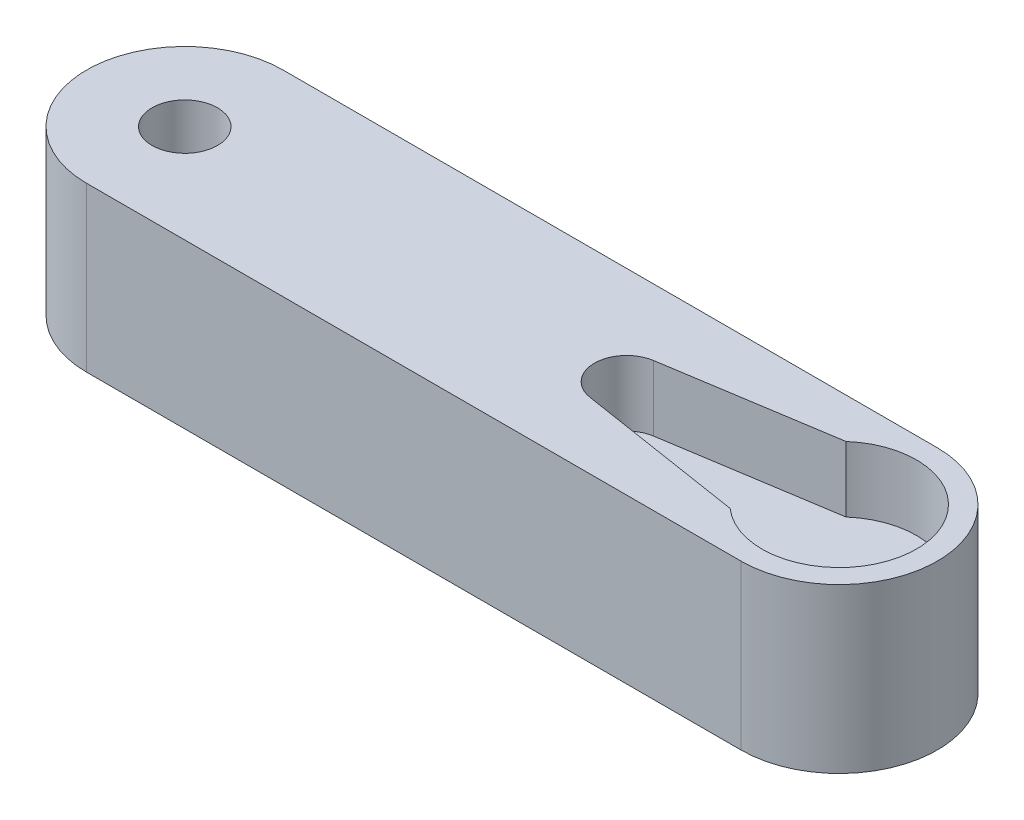
ISO-10303-21;
HEADER;
FILE_DESCRIPTION(('STEP AP214'),'2;1');
FILE_NAME('part.step','',(''),(''),'','','');
FILE_SCHEMA(('AUTOMOTIVE_DESIGN { 1 0 10303 214 1 1 1 1 }'));
ENDSEC;
DATA;
#1=APPLICATION_CONTEXT('core data for automotive mechanical design processes');
#2=APPLICATION_PROTOCOL_DEFINITION('international standard','automotive_design',2000,#1);
#3=PRODUCT_CONTEXT('',#1,'mechanical');
#4=PRODUCT('Part','Part','',(#3));
#5=PRODUCT_RELATED_PRODUCT_CATEGORY('part','',(#4));
#6=PRODUCT_DEFINITION_FORMATION('','',#4);
#7=PRODUCT_DEFINITION_CONTEXT('part definition',#1,'design');
#8=PRODUCT_DEFINITION('design','',#6,#7);
#9=PRODUCT_DEFINITION_SHAPE('','',#8);
#10=(LENGTH_UNIT() NAMED_UNIT(*) SI_UNIT(.MILLI.,.METRE.));
#11=(NAMED_UNIT(*) PLANE_ANGLE_UNIT() SI_UNIT($,.RADIAN.));
#12=(NAMED_UNIT(*) SI_UNIT($,.STERADIAN.) SOLID_ANGLE_UNIT());
#13=UNCERTAINTY_MEASURE_WITH_UNIT(LENGTH_MEASURE(1.E-05),#10,'distance_accuracy_value','');
#14=(GEOMETRIC_REPRESENTATION_CONTEXT(3) GLOBAL_UNCERTAINTY_ASSIGNED_CONTEXT((#13)) GLOBAL_UNIT_ASSIGNED_CONTEXT((#10,
#11,#12)) REPRESENTATION_CONTEXT('',''));
#15=CARTESIAN_POINT('',(0.,0.,0.));
#16=DIRECTION('',(0.,0.,1.));
#17=DIRECTION('',(1.,0.,0.));
#18=AXIS2_PLACEMENT_3D('',#15,#16,#17);
#19=CARTESIAN_POINT('',(-25.4,12.7,0.));
#20=DIRECTION('',(0.,-1.,0.));
#21=DIRECTION('',(0.,0.,-1.));
#22=AXIS2_PLACEMENT_3D('',#19,#20,#21);
#23=CYLINDRICAL_SURFACE('',#22,7.62);
#24=CARTESIAN_POINT('',(-25.4,0.,0.));
#25=DIRECTION('',(0.,1.,0.));
#26=DIRECTION('',(0.,0.,1.));
#27=AXIS2_PLACEMENT_3D('',#24,#25,#26);
#28=CIRCLE('',#27,7.62);
#29=CARTESIAN_POINT('',(-25.4,0.,-7.62));
#30=VERTEX_POINT('',#29);
#31=CARTESIAN_POINT('',(-25.4,0.,7.62));
#32=VERTEX_POINT('',#31);
#33=EDGE_CURVE('E154',#30,#32,#28,.T.);
#34=ORIENTED_EDGE('',*,*,#33,.T.);
#35=DIRECTION('',(0.,-1.,0.));
#36=VECTOR('',#35,1.);
#37=CARTESIAN_POINT('',(-25.4,12.7,7.62));
#38=LINE('',#37,#36);
#39=CARTESIAN_POINT('',(-25.4,12.7,7.62));
#40=VERTEX_POINT('',#39);
#41=EDGE_CURVE('E11',#40,#32,#38,.T.);
#42=ORIENTED_EDGE('',*,*,#41,.F.);
#43=CARTESIAN_POINT('',(-25.4,12.7,0.));
#44=DIRECTION('',(0.,1.,0.));
#45=DIRECTION('',(0.,0.,1.));
#46=AXIS2_PLACEMENT_3D('',#43,#44,#45);
#47=CIRCLE('',#46,7.62);
#48=CARTESIAN_POINT('',(-25.4,12.7,-7.62));
#49=VERTEX_POINT('',#48);
#50=EDGE_CURVE('E157',#49,#40,#47,.T.);
#51=ORIENTED_EDGE('',*,*,#50,.F.);
#52=DIRECTION('',(0.,-1.,0.));
#53=VECTOR('',#52,1.);
#54=CARTESIAN_POINT('',(-25.4,12.7,-7.62));
#55=LINE('',#54,#53);
#56=EDGE_CURVE('E163',#49,#30,#55,.T.);
#57=ORIENTED_EDGE('',*,*,#56,.T.);
#58=EDGE_LOOP('',(#34,#42,#51,#57));
#59=FACE_BOUND('',#58,.T.);
#60=ADVANCED_FACE('F39',(#59),#23,.T.);
#61=CARTESIAN_POINT('',(-25.4,12.7,7.62));
#62=DIRECTION('',(0.,0.,-1.));
#63=DIRECTION('',(-1.,0.,0.));
#64=AXIS2_PLACEMENT_3D('',#61,#62,#63);
#65=PLANE('',#64);
#66=DIRECTION('',(1.,0.,0.));
#67=VECTOR('',#66,1.);
#68=CARTESIAN_POINT('',(-25.4,0.,7.62));
#69=LINE('',#68,#67);
#70=CARTESIAN_POINT('',(25.4,0.,7.62));
#71=VERTEX_POINT('',#70);
#72=EDGE_CURVE('E166',#32,#71,#69,.T.);
#73=ORIENTED_EDGE('',*,*,#72,.T.);
#74=DIRECTION('',(0.,-1.,0.));
#75=VECTOR('',#74,1.);
#76=CARTESIAN_POINT('',(25.4,12.7,7.62));
#77=LINE('',#76,#75);
#78=CARTESIAN_POINT('',(25.4,12.7,7.62));
#79=VERTEX_POINT('',#78);
#80=EDGE_CURVE('E46',#79,#71,#77,.T.);
#81=ORIENTED_EDGE('',*,*,#80,.F.);
#82=DIRECTION('',(1.,0.,0.));
#83=VECTOR('',#82,1.);
#84=CARTESIAN_POINT('',(-25.4,12.7,7.62));
#85=LINE('',#84,#83);
#86=EDGE_CURVE('E90',#40,#79,#85,.T.);
#87=ORIENTED_EDGE('',*,*,#86,.F.);
#88=ORIENTED_EDGE('',*,*,#41,.T.);
#89=EDGE_LOOP('',(#73,#81,#87,#88));
#90=FACE_BOUND('',#89,.T.);
#91=ADVANCED_FACE('F196',(#90),#65,.F.);
#92=CARTESIAN_POINT('',(25.4,12.7,0.));
#93=DIRECTION('',(0.,-1.,0.));
#94=DIRECTION('',(0.,0.,-1.));
#95=AXIS2_PLACEMENT_3D('',#92,#93,#94);
#96=CYLINDRICAL_SURFACE('',#95,7.62);
#97=CARTESIAN_POINT('',(25.4,0.,0.));
#98=DIRECTION('',(0.,1.,0.));
#99=DIRECTION('',(0.,0.,1.));
#100=AXIS2_PLACEMENT_3D('',#97,#98,#99);
#101=CIRCLE('',#100,7.62);
#102=CARTESIAN_POINT('',(25.4,0.,-7.62));
#103=VERTEX_POINT('',#102);
#104=EDGE_CURVE('E168',#71,#103,#101,.T.);
#105=ORIENTED_EDGE('',*,*,#104,.T.);
#106=DIRECTION('',(0.,-1.,0.));
#107=VECTOR('',#106,1.);
#108=CARTESIAN_POINT('',(25.4,12.7,-7.62));
#109=LINE('',#108,#107);
#110=CARTESIAN_POINT('',(25.4,12.7,-7.62));
#111=VERTEX_POINT('',#110);
#112=EDGE_CURVE('E172',#111,#103,#109,.T.);
#113=ORIENTED_EDGE('',*,*,#112,.F.);
#114=CARTESIAN_POINT('',(25.4,12.7,0.));
#115=DIRECTION('',(0.,1.,0.));
#116=DIRECTION('',(0.,0.,1.));
#117=AXIS2_PLACEMENT_3D('',#114,#115,#116);
#118=CIRCLE('',#117,7.62);
#119=EDGE_CURVE('E160',#79,#111,#118,.T.);
#120=ORIENTED_EDGE('',*,*,#119,.F.);
#121=ORIENTED_EDGE('',*,*,#80,.T.);
#122=EDGE_LOOP('',(#105,#113,#120,#121));
#123=FACE_BOUND('',#122,.T.);
#124=ADVANCED_FACE('F177',(#123),#96,.T.);
#125=CARTESIAN_POINT('',(-25.4,12.7,-7.62));
#126=DIRECTION('',(0.,0.,1.));
#127=DIRECTION('',(1.,0.,0.));
#128=AXIS2_PLACEMENT_3D('',#125,#126,#127);
#129=PLANE('',#128);
#130=DIRECTION('',(-1.,0.,0.));
#131=VECTOR('',#130,1.);
#132=CARTESIAN_POINT('',(-25.4,0.,-7.62));
#133=LINE('',#132,#131);
#134=EDGE_CURVE('E83',#103,#30,#133,.T.);
#135=ORIENTED_EDGE('',*,*,#134,.T.);
#136=ORIENTED_EDGE('',*,*,#56,.F.);
#137=DIRECTION('',(-1.,0.,0.));
#138=VECTOR('',#137,1.);
#139=CARTESIAN_POINT('',(-25.4,12.7,-7.62));
#140=LINE('',#139,#138);
#141=EDGE_CURVE('E62',#111,#49,#140,.T.);
#142=ORIENTED_EDGE('',*,*,#141,.F.);
#143=ORIENTED_EDGE('',*,*,#112,.T.);
#144=EDGE_LOOP('',(#135,#136,#142,#143));
#145=FACE_BOUND('',#144,.T.);
#146=ADVANCED_FACE('F185',(#145),#129,.F.);
#147=CARTESIAN_POINT('',(-25.4,12.7,0.));
#148=DIRECTION('',(0.,1.,0.));
#149=DIRECTION('',(0.,0.,1.));
#150=AXIS2_PLACEMENT_3D('',#147,#148,#149);
#151=PLANE('',#150);
#152=CARTESIAN_POINT('',(8.89999109000001,12.7,1.13785289425066E-13));
#153=DIRECTION('',(0.,1.,0.));
#154=DIRECTION('',(0.,0.,1.));
#155=AXIS2_PLACEMENT_3D('',#152,#153,#154);
#156=CIRCLE('',#155,2.50000135);
#157=CARTESIAN_POINT('',(8.51187668267993,12.7,-2.46969106505892));
#158=VERTEX_POINT('',#157);
#159=CARTESIAN_POINT('',(8.51187668267998,12.7,2.46969106505915));
#160=VERTEX_POINT('',#159);
#161=EDGE_CURVE('E53',#158,#160,#156,.T.);
#162=ORIENTED_EDGE('',*,*,#161,.F.);
#163=DIRECTION('',(-0.987875892570632,0.,0.155245679095352));
#164=VECTOR('',#163,1.);
#165=CARTESIAN_POINT('',(21.4313708903444,12.7,-4.50000242999986));
#166=LINE('',#165,#164);
#167=CARTESIAN_POINT('',(21.4313708903444,12.7,-4.50000242999986));
#168=VERTEX_POINT('',#167);
#169=EDGE_CURVE('E132',#168,#158,#166,.T.);
#170=ORIENTED_EDGE('',*,*,#169,.F.);
#171=CARTESIAN_POINT('',(25.4,12.7,0.));
#172=DIRECTION('',(0.,1.,0.));
#173=DIRECTION('',(0.,0.,1.));
#174=AXIS2_PLACEMENT_3D('',#171,#172,#173);
#175=CIRCLE('',#174,6.00000323999999);
#176=CARTESIAN_POINT('',(21.4313708903446,12.7,4.50000243000003));
#177=VERTEX_POINT('',#176);
#178=EDGE_CURVE('E135',#177,#168,#175,.T.);
#179=ORIENTED_EDGE('',*,*,#178,.F.);
#180=DIRECTION('',(0.987875892570633,0.,0.155245679095345));
#181=VECTOR('',#180,1.);
#182=CARTESIAN_POINT('',(8.51187668267998,12.7,2.46969106505915));
#183=LINE('',#182,#181);
#184=EDGE_CURVE('E141',#160,#177,#183,.T.);
#185=ORIENTED_EDGE('',*,*,#184,.F.);
#186=EDGE_LOOP('',(#162,#170,#179,#185));
#187=FACE_BOUND('',#186,.T.);
#188=CARTESIAN_POINT('',(-25.4,12.7,0.));
#189=DIRECTION('',(0.,1.,0.));
#190=DIRECTION('',(0.,0.,1.));
#191=AXIS2_PLACEMENT_3D('',#188,#189,#190);
#192=CIRCLE('',#191,2.54);
#193=CARTESIAN_POINT('',(-25.4,12.7,2.54));
#194=VERTEX_POINT('',#193);
#195=EDGE_CURVE('E147',#194,#194,#192,.T.);
#196=ORIENTED_EDGE('',*,*,#195,.F.);
#197=EDGE_LOOP('',(#196));
#198=FACE_BOUND('',#197,.T.);
#199=ORIENTED_EDGE('',*,*,#50,.T.);
#200=ORIENTED_EDGE('',*,*,#86,.T.);
#201=ORIENTED_EDGE('',*,*,#119,.T.);
#202=ORIENTED_EDGE('',*,*,#141,.T.);
#203=EDGE_LOOP('',(#199,#200,#201,#202));
#204=FACE_BOUND('',#203,.T.);
#205=ADVANCED_FACE('F187',(#187,#198,#204),#151,.T.);
#206=CARTESIAN_POINT('',(-25.4,0.,0.));
#207=DIRECTION('',(0.,1.,0.));
#208=DIRECTION('',(0.,0.,1.));
#209=AXIS2_PLACEMENT_3D('',#206,#207,#208);
#210=PLANE('',#209);
#211=CARTESIAN_POINT('',(-25.4,0.,0.));
#212=DIRECTION('',(0.,1.,0.));
#213=DIRECTION('',(0.,0.,1.));
#214=AXIS2_PLACEMENT_3D('',#211,#212,#213);
#215=CIRCLE('',#214,2.54);
#216=CARTESIAN_POINT('',(-25.4,0.,2.54));
#217=VERTEX_POINT('',#216);
#218=EDGE_CURVE('E151',#217,#217,#215,.T.);
#219=ORIENTED_EDGE('',*,*,#218,.T.);
#220=EDGE_LOOP('',(#219));
#221=FACE_BOUND('',#220,.T.);
#222=ORIENTED_EDGE('',*,*,#33,.F.);
#223=ORIENTED_EDGE('',*,*,#134,.F.);
#224=ORIENTED_EDGE('',*,*,#104,.F.);
#225=ORIENTED_EDGE('',*,*,#72,.F.);
#226=EDGE_LOOP('',(#222,#223,#224,#225));
#227=FACE_BOUND('',#226,.T.);
#228=ADVANCED_FACE('F181',(#221,#227),#210,.F.);
#229=CARTESIAN_POINT('',(-25.4,0.,0.));
#230=DIRECTION('',(0.,1.,0.));
#231=DIRECTION('',(0.,0.,1.));
#232=AXIS2_PLACEMENT_3D('',#229,#230,#231);
#233=CYLINDRICAL_SURFACE('',#232,2.54);
#234=ORIENTED_EDGE('',*,*,#218,.F.);
#235=EDGE_LOOP('',(#234));
#236=FACE_BOUND('',#235,.T.);
#237=ORIENTED_EDGE('',*,*,#195,.T.);
#238=EDGE_LOOP('',(#237));
#239=FACE_BOUND('',#238,.T.);
#240=ADVANCED_FACE('F231',(#236,#239),#233,.F.);
#241=CARTESIAN_POINT('',(8.89999109000001,7.62,1.13785289425066E-13));
#242=DIRECTION('',(0.,1.,0.));
#243=DIRECTION('',(0.,0.,1.));
#244=AXIS2_PLACEMENT_3D('',#241,#242,#243);
#245=CYLINDRICAL_SURFACE('',#244,2.50000135);
#246=ORIENTED_EDGE('',*,*,#161,.T.);
#247=DIRECTION('',(0.,1.,0.));
#248=VECTOR('',#247,1.);
#249=CARTESIAN_POINT('',(8.51187668267998,7.62,2.46969106505915));
#250=LINE('',#249,#248);
#251=CARTESIAN_POINT('',(8.51187668267998,7.62,2.46969106505915));
#252=VERTEX_POINT('',#251);
#253=EDGE_CURVE('E110',#252,#160,#250,.T.);
#254=ORIENTED_EDGE('',*,*,#253,.F.);
#255=CARTESIAN_POINT('',(8.89999109000001,7.62,1.13785289425066E-13));
#256=DIRECTION('',(0.,1.,0.));
#257=DIRECTION('',(0.,0.,1.));
#258=AXIS2_PLACEMENT_3D('',#255,#256,#257);
#259=CIRCLE('',#258,2.50000135);
#260=CARTESIAN_POINT('',(8.51187668267993,7.62,-2.46969106505892));
#261=VERTEX_POINT('',#260);
#262=EDGE_CURVE('E114',#261,#252,#259,.T.);
#263=ORIENTED_EDGE('',*,*,#262,.F.);
#264=DIRECTION('',(0.,1.,0.));
#265=VECTOR('',#264,1.);
#266=CARTESIAN_POINT('',(8.51187668267993,7.62,-2.46969106505892));
#267=LINE('',#266,#265);
#268=EDGE_CURVE('E145',#261,#158,#267,.T.);
#269=ORIENTED_EDGE('',*,*,#268,.T.);
#270=EDGE_LOOP('',(#246,#254,#263,#269));
#271=FACE_BOUND('',#270,.T.);
#272=ADVANCED_FACE('F112',(#271),#245,.F.);
#273=CARTESIAN_POINT('',(21.4313708903444,7.62,-4.50000242999986));
#274=DIRECTION('',(-0.155245679095352,0.,-0.987875892570632));
#275=DIRECTION('',(-0.987875892570632,0.,0.155245679095352));
#276=AXIS2_PLACEMENT_3D('',#273,#274,#275);
#277=PLANE('',#276);
#278=ORIENTED_EDGE('',*,*,#169,.T.);
#279=ORIENTED_EDGE('',*,*,#268,.F.);
#280=DIRECTION('',(-0.987875892570632,0.,0.155245679095352));
#281=VECTOR('',#280,1.);
#282=CARTESIAN_POINT('',(21.4313708903444,7.62,-4.50000242999986));
#283=LINE('',#282,#281);
#284=CARTESIAN_POINT('',(21.4313708903444,7.62,-4.50000242999986));
#285=VERTEX_POINT('',#284);
#286=EDGE_CURVE('E120',#285,#261,#283,.T.);
#287=ORIENTED_EDGE('',*,*,#286,.F.);
#288=DIRECTION('',(0.,1.,0.));
#289=VECTOR('',#288,1.);
#290=CARTESIAN_POINT('',(21.4313708903444,7.62,-4.50000242999986));
#291=LINE('',#290,#289);
#292=EDGE_CURVE('E148',#285,#168,#291,.T.);
#293=ORIENTED_EDGE('',*,*,#292,.T.);
#294=EDGE_LOOP('',(#278,#279,#287,#293));
#295=FACE_BOUND('',#294,.T.);
#296=ADVANCED_FACE('F247',(#295),#277,.F.);
#297=CARTESIAN_POINT('',(25.4,7.62,0.));
#298=DIRECTION('',(0.,1.,0.));
#299=DIRECTION('',(0.,0.,1.));
#300=AXIS2_PLACEMENT_3D('',#297,#298,#299);
#301=CYLINDRICAL_SURFACE('',#300,6.00000323999999);
#302=ORIENTED_EDGE('',*,*,#178,.T.);
#303=ORIENTED_EDGE('',*,*,#292,.F.);
#304=CARTESIAN_POINT('',(25.4,7.62,0.));
#305=DIRECTION('',(0.,1.,0.));
#306=DIRECTION('',(0.,0.,1.));
#307=AXIS2_PLACEMENT_3D('',#304,#305,#306);
#308=CIRCLE('',#307,6.00000323999999);
#309=CARTESIAN_POINT('',(21.4313708903446,7.62,4.50000243000003));
#310=VERTEX_POINT('',#309);
#311=EDGE_CURVE('E128',#310,#285,#308,.T.);
#312=ORIENTED_EDGE('',*,*,#311,.F.);
#313=DIRECTION('',(0.,1.,0.));
#314=VECTOR('',#313,1.);
#315=CARTESIAN_POINT('',(21.4313708903446,7.62,4.50000243000003));
#316=LINE('',#315,#314);
#317=EDGE_CURVE('E119',#310,#177,#316,.T.);
#318=ORIENTED_EDGE('',*,*,#317,.T.);
#319=EDGE_LOOP('',(#302,#303,#312,#318));
#320=FACE_BOUND('',#319,.T.);
#321=ADVANCED_FACE('F256',(#320),#301,.F.);
#322=CARTESIAN_POINT('',(8.51187668267998,7.62,2.46969106505915));
#323=DIRECTION('',(-0.155245679095345,0.,0.987875892570633));
#324=DIRECTION('',(0.987875892570633,0.,0.155245679095345));
#325=AXIS2_PLACEMENT_3D('',#322,#323,#324);
#326=PLANE('',#325);
#327=ORIENTED_EDGE('',*,*,#184,.T.);
#328=ORIENTED_EDGE('',*,*,#317,.F.);
#329=DIRECTION('',(0.987875892570633,0.,0.155245679095345));
#330=VECTOR('',#329,1.);
#331=CARTESIAN_POINT('',(8.51187668267998,7.62,2.46969106505915));
#332=LINE('',#331,#330);
#333=EDGE_CURVE('E123',#252,#310,#332,.T.);
#334=ORIENTED_EDGE('',*,*,#333,.F.);
#335=ORIENTED_EDGE('',*,*,#253,.T.);
#336=EDGE_LOOP('',(#327,#328,#334,#335));
#337=FACE_BOUND('',#336,.T.);
#338=ADVANCED_FACE('F124',(#337),#326,.F.);
#339=CARTESIAN_POINT('',(8.89999109000001,7.62,1.13785289425066E-13));
#340=DIRECTION('',(0.,1.,0.));
#341=DIRECTION('',(0.,0.,1.));
#342=AXIS2_PLACEMENT_3D('',#339,#340,#341);
#343=PLANE('',#342);
#344=ORIENTED_EDGE('',*,*,#262,.T.);
#345=ORIENTED_EDGE('',*,*,#333,.T.);
#346=ORIENTED_EDGE('',*,*,#311,.T.);
#347=ORIENTED_EDGE('',*,*,#286,.T.);
#348=EDGE_LOOP('',(#344,#345,#346,#347));
#349=FACE_BOUND('',#348,.T.);
#350=ADVANCED_FACE('F130',(#349),#343,.T.);
#351=CLOSED_SHELL('',(#60,#91,#124,#146,#205,#228,#240,#272,#296,#321,#338,#350));
#352=MANIFOLD_SOLID_BREP('B2',#351);
#353=ADVANCED_BREP_SHAPE_REPRESENTATION('',(#18,#352),#14);
#354=SHAPE_DEFINITION_REPRESENTATION(#9,#353);
ENDSEC;
END-ISO-10303-21;
